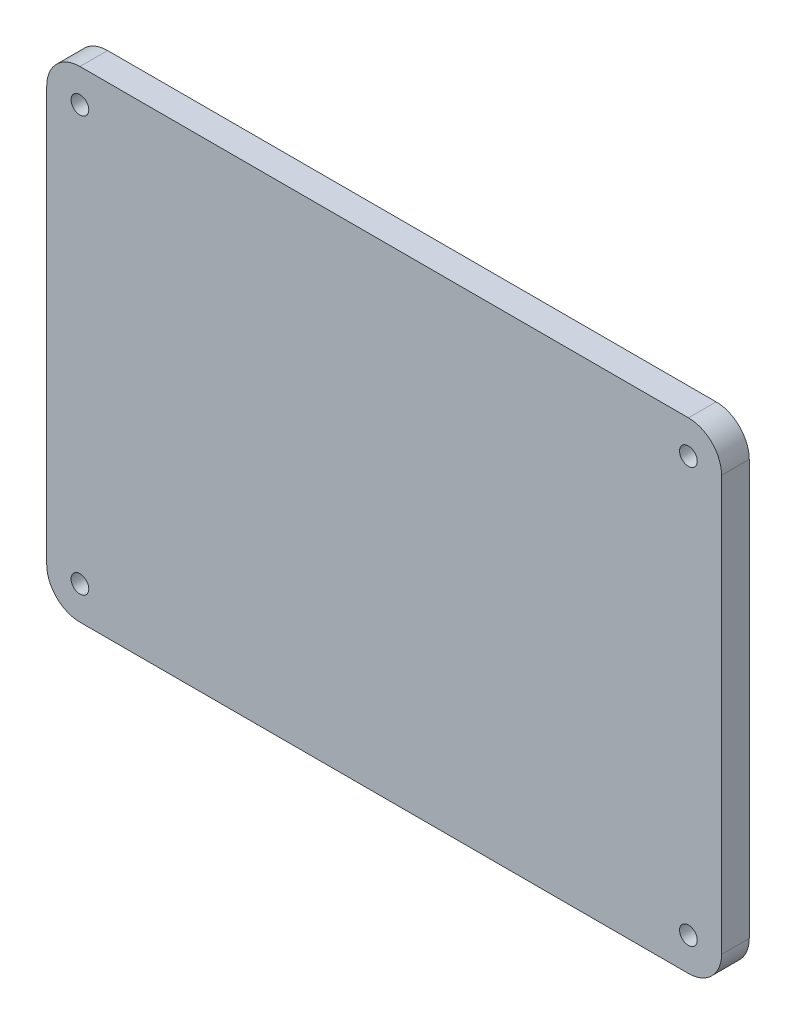
ISO-10303-21;
HEADER;
FILE_DESCRIPTION(('STEP AP214'),'2;1');
FILE_NAME('part.step','',(''),(''),'','','');
FILE_SCHEMA(('AUTOMOTIVE_DESIGN { 1 0 10303 214 1 1 1 1 }'));
ENDSEC;
DATA;
#1=APPLICATION_CONTEXT('core data for automotive mechanical design processes');
#2=APPLICATION_PROTOCOL_DEFINITION('international standard','automotive_design',2000,#1);
#3=PRODUCT_CONTEXT('',#1,'mechanical');
#4=PRODUCT('Part','Part','',(#3));
#5=PRODUCT_RELATED_PRODUCT_CATEGORY('part','',(#4));
#6=PRODUCT_DEFINITION_FORMATION('','',#4);
#7=PRODUCT_DEFINITION_CONTEXT('part definition',#1,'design');
#8=PRODUCT_DEFINITION('design','',#6,#7);
#9=PRODUCT_DEFINITION_SHAPE('','',#8);
#10=(LENGTH_UNIT() NAMED_UNIT(*) SI_UNIT(.MILLI.,.METRE.));
#11=(NAMED_UNIT(*) PLANE_ANGLE_UNIT() SI_UNIT($,.RADIAN.));
#12=(NAMED_UNIT(*) SI_UNIT($,.STERADIAN.) SOLID_ANGLE_UNIT());
#13=UNCERTAINTY_MEASURE_WITH_UNIT(LENGTH_MEASURE(1.E-05),#10,'distance_accuracy_value','');
#14=(GEOMETRIC_REPRESENTATION_CONTEXT(3) GLOBAL_UNCERTAINTY_ASSIGNED_CONTEXT((#13)) GLOBAL_UNIT_ASSIGNED_CONTEXT((#10,
#11,#12)) REPRESENTATION_CONTEXT('',''));
#15=CARTESIAN_POINT('',(0.,0.,0.));
#16=DIRECTION('',(0.,0.,1.));
#17=DIRECTION('',(1.,0.,0.));
#18=AXIS2_PLACEMENT_3D('',#15,#16,#17);
#19=CARTESIAN_POINT('',(130.,-7.99999999999994,5.));
#20=DIRECTION('',(0.,0.,1.));
#21=DIRECTION('',(1.,0.,0.));
#22=AXIS2_PLACEMENT_3D('',#19,#20,#21);
#23=PLANE('',#22);
#24=CARTESIAN_POINT('',(20.0000000000003,-7.99999999999997,5.));
#25=DIRECTION('',(0.,0.,1.));
#26=DIRECTION('',(1.,0.,0.));
#27=AXIS2_PLACEMENT_3D('',#24,#25,#26);
#28=CIRCLE('',#27,1.6);
#29=CARTESIAN_POINT('',(21.6000000000003,-7.99999999999997,5.));
#30=VERTEX_POINT('',#29);
#31=EDGE_CURVE('E191',#30,#30,#28,.T.);
#32=ORIENTED_EDGE('',*,*,#31,.F.);
#33=EDGE_LOOP('',(#32));
#34=FACE_BOUND('',#33,.T.);
#35=CARTESIAN_POINT('',(130.,67.0000000000001,5.));
#36=DIRECTION('',(0.,0.,1.));
#37=DIRECTION('',(1.,0.,0.));
#38=AXIS2_PLACEMENT_3D('',#35,#36,#37);
#39=CIRCLE('',#38,1.59999999999999);
#40=CARTESIAN_POINT('',(131.6,67.0000000000001,5.));
#41=VERTEX_POINT('',#40);
#42=EDGE_CURVE('E137',#41,#41,#39,.T.);
#43=ORIENTED_EDGE('',*,*,#42,.F.);
#44=EDGE_LOOP('',(#43));
#45=FACE_BOUND('',#44,.T.);
#46=CARTESIAN_POINT('',(130.,-7.99999999999994,5.));
#47=DIRECTION('',(0.,0.,1.));
#48=DIRECTION('',(1.,0.,0.));
#49=AXIS2_PLACEMENT_3D('',#46,#47,#48);
#50=CIRCLE('',#49,6.00000000000001);
#51=CARTESIAN_POINT('',(130.,-14.,5.));
#52=VERTEX_POINT('',#51);
#53=CARTESIAN_POINT('',(136.,-7.99999999999994,5.));
#54=VERTEX_POINT('',#53);
#55=EDGE_CURVE('E148',#52,#54,#50,.T.);
#56=ORIENTED_EDGE('',*,*,#55,.T.);
#57=DIRECTION('',(0.,1.,0.));
#58=VECTOR('',#57,1.);
#59=CARTESIAN_POINT('',(136.,-7.99999999999994,5.));
#60=LINE('',#59,#58);
#61=CARTESIAN_POINT('',(136.,67.0000000000001,5.));
#62=VERTEX_POINT('',#61);
#63=EDGE_CURVE('E96',#54,#62,#60,.T.);
#64=ORIENTED_EDGE('',*,*,#63,.T.);
#65=CARTESIAN_POINT('',(130.,67.0000000000001,5.));
#66=DIRECTION('',(0.,0.,1.));
#67=DIRECTION('',(1.,0.,0.));
#68=AXIS2_PLACEMENT_3D('',#65,#66,#67);
#69=CIRCLE('',#68,5.99999999999973);
#70=CARTESIAN_POINT('',(130.,73.0000000000001,5.));
#71=VERTEX_POINT('',#70);
#72=EDGE_CURVE('E163',#62,#71,#69,.T.);
#73=ORIENTED_EDGE('',*,*,#72,.T.);
#74=DIRECTION('',(-1.,0.,0.));
#75=VECTOR('',#74,1.);
#76=CARTESIAN_POINT('',(130.,73.0000000000001,5.));
#77=LINE('',#76,#75);
#78=CARTESIAN_POINT('',(19.9999999999999,72.9999999999995,5.));
#79=VERTEX_POINT('',#78);
#80=EDGE_CURVE('E176',#71,#79,#77,.T.);
#81=ORIENTED_EDGE('',*,*,#80,.T.);
#82=CARTESIAN_POINT('',(20.0000000000003,66.9999999999993,5.));
#83=DIRECTION('',(0.,0.,1.));
#84=DIRECTION('',(1.,0.,0.));
#85=AXIS2_PLACEMENT_3D('',#82,#83,#84);
#86=CIRCLE('',#85,6.00000000000022);
#87=CARTESIAN_POINT('',(13.9999999999999,66.9999999999993,5.));
#88=VERTEX_POINT('',#87);
#89=EDGE_CURVE('E115',#79,#88,#86,.T.);
#90=ORIENTED_EDGE('',*,*,#89,.T.);
#91=DIRECTION('',(0.,-1.,0.));
#92=VECTOR('',#91,1.);
#93=CARTESIAN_POINT('',(14.0000000000003,-8.00000000000071,5.));
#94=LINE('',#93,#92);
#95=CARTESIAN_POINT('',(14.0000000000003,-8.00000000000071,5.));
#96=VERTEX_POINT('',#95);
#97=EDGE_CURVE('E109',#88,#96,#94,.T.);
#98=ORIENTED_EDGE('',*,*,#97,.T.);
#99=CARTESIAN_POINT('',(20.0000000000003,-8.00000000000071,5.));
#100=DIRECTION('',(0.,0.,1.));
#101=DIRECTION('',(1.,0.,0.));
#102=AXIS2_PLACEMENT_3D('',#99,#100,#101);
#103=CIRCLE('',#102,6.00000000000002);
#104=CARTESIAN_POINT('',(20.0000000000003,-14.0000000000007,5.));
#105=VERTEX_POINT('',#104);
#106=EDGE_CURVE('E113',#96,#105,#103,.T.);
#107=ORIENTED_EDGE('',*,*,#106,.T.);
#108=DIRECTION('',(1.,0.,0.));
#109=VECTOR('',#108,1.);
#110=CARTESIAN_POINT('',(130.,-14.,5.));
#111=LINE('',#110,#109);
#112=EDGE_CURVE('E53',#105,#52,#111,.T.);
#113=ORIENTED_EDGE('',*,*,#112,.T.);
#114=EDGE_LOOP('',(#56,#64,#73,#81,#90,#98,#107,#113));
#115=FACE_BOUND('',#114,.T.);
#116=CARTESIAN_POINT('',(20.0000000000003,67.,5.));
#117=DIRECTION('',(0.,0.,1.));
#118=DIRECTION('',(1.,0.,0.));
#119=AXIS2_PLACEMENT_3D('',#116,#117,#118);
#120=CIRCLE('',#119,1.6);
#121=CARTESIAN_POINT('',(21.6000000000003,67.,5.));
#122=VERTEX_POINT('',#121);
#123=EDGE_CURVE('E185',#122,#122,#120,.T.);
#124=ORIENTED_EDGE('',*,*,#123,.F.);
#125=EDGE_LOOP('',(#124));
#126=FACE_BOUND('',#125,.T.);
#127=CARTESIAN_POINT('',(130.,-7.99999999999994,5.));
#128=DIRECTION('',(0.,0.,1.));
#129=DIRECTION('',(1.,0.,0.));
#130=AXIS2_PLACEMENT_3D('',#127,#128,#129);
#131=CIRCLE('',#130,1.59999999999999);
#132=CARTESIAN_POINT('',(131.6,-7.99999999999994,5.));
#133=VERTEX_POINT('',#132);
#134=EDGE_CURVE('E197',#133,#133,#131,.T.);
#135=ORIENTED_EDGE('',*,*,#134,.F.);
#136=EDGE_LOOP('',(#135));
#137=FACE_BOUND('',#136,.T.);
#138=ADVANCED_FACE('F36',(#34,#45,#115,#126,#137),#23,.T.);
#139=CARTESIAN_POINT('',(130.,-7.99999999999994,0.));
#140=DIRECTION('',(0.,0.,1.));
#141=DIRECTION('',(1.,0.,0.));
#142=AXIS2_PLACEMENT_3D('',#139,#140,#141);
#143=PLANE('',#142);
#144=CARTESIAN_POINT('',(130.,-7.99999999999994,0.));
#145=DIRECTION('',(0.,0.,1.));
#146=DIRECTION('',(1.,0.,0.));
#147=AXIS2_PLACEMENT_3D('',#144,#145,#146);
#148=CIRCLE('',#147,6.00000000000001);
#149=CARTESIAN_POINT('',(130.,-14.,0.));
#150=VERTEX_POINT('',#149);
#151=CARTESIAN_POINT('',(136.,-7.99999999999994,0.));
#152=VERTEX_POINT('',#151);
#153=EDGE_CURVE('E133',#150,#152,#148,.T.);
#154=ORIENTED_EDGE('',*,*,#153,.F.);
#155=DIRECTION('',(1.,0.,0.));
#156=VECTOR('',#155,1.);
#157=CARTESIAN_POINT('',(130.,-14.,0.));
#158=LINE('',#157,#156);
#159=CARTESIAN_POINT('',(20.0000000000003,-14.0000000000007,0.));
#160=VERTEX_POINT('',#159);
#161=EDGE_CURVE('E88',#160,#150,#158,.T.);
#162=ORIENTED_EDGE('',*,*,#161,.F.);
#163=CARTESIAN_POINT('',(20.0000000000003,-8.00000000000071,0.));
#164=DIRECTION('',(0.,0.,1.));
#165=DIRECTION('',(1.,0.,0.));
#166=AXIS2_PLACEMENT_3D('',#163,#164,#165);
#167=CIRCLE('',#166,6.00000000000002);
#168=CARTESIAN_POINT('',(14.0000000000003,-8.00000000000071,0.));
#169=VERTEX_POINT('',#168);
#170=EDGE_CURVE('E82',#169,#160,#167,.T.);
#171=ORIENTED_EDGE('',*,*,#170,.F.);
#172=DIRECTION('',(0.,-1.,0.));
#173=VECTOR('',#172,1.);
#174=CARTESIAN_POINT('',(14.0000000000003,-8.00000000000071,0.));
#175=LINE('',#174,#173);
#176=CARTESIAN_POINT('',(13.9999999999999,66.9999999999993,0.));
#177=VERTEX_POINT('',#176);
#178=EDGE_CURVE('E123',#177,#169,#175,.T.);
#179=ORIENTED_EDGE('',*,*,#178,.F.);
#180=CARTESIAN_POINT('',(20.0000000000003,66.9999999999993,0.));
#181=DIRECTION('',(0.,0.,1.));
#182=DIRECTION('',(1.,0.,0.));
#183=AXIS2_PLACEMENT_3D('',#180,#181,#182);
#184=CIRCLE('',#183,6.00000000000022);
#185=CARTESIAN_POINT('',(19.9999999999999,72.9999999999995,0.));
#186=VERTEX_POINT('',#185);
#187=EDGE_CURVE('E143',#186,#177,#184,.T.);
#188=ORIENTED_EDGE('',*,*,#187,.F.);
#189=DIRECTION('',(-1.,0.,0.));
#190=VECTOR('',#189,1.);
#191=CARTESIAN_POINT('',(130.,73.0000000000001,0.));
#192=LINE('',#191,#190);
#193=CARTESIAN_POINT('',(130.,73.0000000000001,0.));
#194=VERTEX_POINT('',#193);
#195=EDGE_CURVE('E141',#194,#186,#192,.T.);
#196=ORIENTED_EDGE('',*,*,#195,.F.);
#197=CARTESIAN_POINT('',(130.,67.0000000000001,0.));
#198=DIRECTION('',(0.,0.,1.));
#199=DIRECTION('',(1.,0.,0.));
#200=AXIS2_PLACEMENT_3D('',#197,#198,#199);
#201=CIRCLE('',#200,5.99999999999973);
#202=CARTESIAN_POINT('',(136.,67.0000000000001,0.));
#203=VERTEX_POINT('',#202);
#204=EDGE_CURVE('E139',#203,#194,#201,.T.);
#205=ORIENTED_EDGE('',*,*,#204,.F.);
#206=DIRECTION('',(0.,1.,0.));
#207=VECTOR('',#206,1.);
#208=CARTESIAN_POINT('',(136.,-7.99999999999994,0.));
#209=LINE('',#208,#207);
#210=EDGE_CURVE('E136',#152,#203,#209,.T.);
#211=ORIENTED_EDGE('',*,*,#210,.F.);
#212=EDGE_LOOP('',(#154,#162,#171,#179,#188,#196,#205,#211));
#213=FACE_BOUND('',#212,.T.);
#214=CARTESIAN_POINT('',(130.,67.0000000000001,0.));
#215=DIRECTION('',(0.,0.,1.));
#216=DIRECTION('',(1.,0.,0.));
#217=AXIS2_PLACEMENT_3D('',#214,#215,#216);
#218=CIRCLE('',#217,1.59999999999999);
#219=CARTESIAN_POINT('',(131.6,67.0000000000001,0.));
#220=VERTEX_POINT('',#219);
#221=EDGE_CURVE('E182',#220,#220,#218,.T.);
#222=ORIENTED_EDGE('',*,*,#221,.T.);
#223=EDGE_LOOP('',(#222));
#224=FACE_BOUND('',#223,.T.);
#225=CARTESIAN_POINT('',(20.0000000000003,67.,0.));
#226=DIRECTION('',(0.,0.,1.));
#227=DIRECTION('',(1.,0.,0.));
#228=AXIS2_PLACEMENT_3D('',#225,#226,#227);
#229=CIRCLE('',#228,1.6);
#230=CARTESIAN_POINT('',(21.6000000000003,67.,0.));
#231=VERTEX_POINT('',#230);
#232=EDGE_CURVE('E188',#231,#231,#229,.T.);
#233=ORIENTED_EDGE('',*,*,#232,.T.);
#234=EDGE_LOOP('',(#233));
#235=FACE_BOUND('',#234,.T.);
#236=CARTESIAN_POINT('',(20.0000000000003,-7.99999999999997,0.));
#237=DIRECTION('',(0.,0.,1.));
#238=DIRECTION('',(1.,0.,0.));
#239=AXIS2_PLACEMENT_3D('',#236,#237,#238);
#240=CIRCLE('',#239,1.6);
#241=CARTESIAN_POINT('',(21.6000000000003,-7.99999999999997,0.));
#242=VERTEX_POINT('',#241);
#243=EDGE_CURVE('E194',#242,#242,#240,.T.);
#244=ORIENTED_EDGE('',*,*,#243,.T.);
#245=EDGE_LOOP('',(#244));
#246=FACE_BOUND('',#245,.T.);
#247=CARTESIAN_POINT('',(130.,-7.99999999999994,0.));
#248=DIRECTION('',(0.,0.,1.));
#249=DIRECTION('',(1.,0.,0.));
#250=AXIS2_PLACEMENT_3D('',#247,#248,#249);
#251=CIRCLE('',#250,1.59999999999999);
#252=CARTESIAN_POINT('',(131.6,-7.99999999999994,0.));
#253=VERTEX_POINT('',#252);
#254=EDGE_CURVE('E200',#253,#253,#251,.T.);
#255=ORIENTED_EDGE('',*,*,#254,.T.);
#256=EDGE_LOOP('',(#255));
#257=FACE_BOUND('',#256,.T.);
#258=ADVANCED_FACE('F167',(#213,#224,#235,#246,#257),#143,.F.);
#259=CARTESIAN_POINT('',(130.,-7.99999999999994,5.));
#260=DIRECTION('',(0.,0.,-1.));
#261=DIRECTION('',(-1.,0.,0.));
#262=AXIS2_PLACEMENT_3D('',#259,#260,#261);
#263=CYLINDRICAL_SURFACE('',#262,6.00000000000001);
#264=ORIENTED_EDGE('',*,*,#153,.T.);
#265=DIRECTION('',(0.,0.,-1.));
#266=VECTOR('',#265,1.);
#267=CARTESIAN_POINT('',(136.,-7.99999999999994,5.));
#268=LINE('',#267,#266);
#269=EDGE_CURVE('E11',#54,#152,#268,.T.);
#270=ORIENTED_EDGE('',*,*,#269,.F.);
#271=ORIENTED_EDGE('',*,*,#55,.F.);
#272=DIRECTION('',(0.,0.,-1.));
#273=VECTOR('',#272,1.);
#274=CARTESIAN_POINT('',(130.,-14.,5.));
#275=LINE('',#274,#273);
#276=EDGE_CURVE('E129',#52,#150,#275,.T.);
#277=ORIENTED_EDGE('',*,*,#276,.T.);
#278=EDGE_LOOP('',(#264,#270,#271,#277));
#279=FACE_BOUND('',#278,.T.);
#280=ADVANCED_FACE('F38',(#279),#263,.T.);
#281=CARTESIAN_POINT('',(136.,-7.99999999999994,5.));
#282=DIRECTION('',(-1.,0.,0.));
#283=DIRECTION('',(0.,-1.,0.));
#284=AXIS2_PLACEMENT_3D('',#281,#282,#283);
#285=PLANE('',#284);
#286=ORIENTED_EDGE('',*,*,#210,.T.);
#287=DIRECTION('',(0.,0.,-1.));
#288=VECTOR('',#287,1.);
#289=CARTESIAN_POINT('',(136.,67.0000000000001,5.));
#290=LINE('',#289,#288);
#291=EDGE_CURVE('E45',#62,#203,#290,.T.);
#292=ORIENTED_EDGE('',*,*,#291,.F.);
#293=ORIENTED_EDGE('',*,*,#63,.F.);
#294=ORIENTED_EDGE('',*,*,#269,.T.);
#295=EDGE_LOOP('',(#286,#292,#293,#294));
#296=FACE_BOUND('',#295,.T.);
#297=ADVANCED_FACE('F234',(#296),#285,.F.);
#298=CARTESIAN_POINT('',(130.,67.0000000000001,5.));
#299=DIRECTION('',(0.,0.,-1.));
#300=DIRECTION('',(-1.,0.,0.));
#301=AXIS2_PLACEMENT_3D('',#298,#299,#300);
#302=CYLINDRICAL_SURFACE('',#301,5.99999999999973);
#303=ORIENTED_EDGE('',*,*,#204,.T.);
#304=DIRECTION('',(0.,0.,-1.));
#305=VECTOR('',#304,1.);
#306=CARTESIAN_POINT('',(130.,73.0000000000001,5.));
#307=LINE('',#306,#305);
#308=EDGE_CURVE('E155',#71,#194,#307,.T.);
#309=ORIENTED_EDGE('',*,*,#308,.F.);
#310=ORIENTED_EDGE('',*,*,#72,.F.);
#311=ORIENTED_EDGE('',*,*,#291,.T.);
#312=EDGE_LOOP('',(#303,#309,#310,#311));
#313=FACE_BOUND('',#312,.T.);
#314=ADVANCED_FACE('F161',(#313),#302,.T.);
#315=CARTESIAN_POINT('',(130.,73.0000000000001,5.));
#316=DIRECTION('',(0.,-1.,0.));
#317=DIRECTION('',(1.,0.,0.));
#318=AXIS2_PLACEMENT_3D('',#315,#316,#317);
#319=PLANE('',#318);
#320=ORIENTED_EDGE('',*,*,#195,.T.);
#321=DIRECTION('',(0.,0.,-1.));
#322=VECTOR('',#321,1.);
#323=CARTESIAN_POINT('',(19.9999999999999,72.9999999999995,5.));
#324=LINE('',#323,#322);
#325=EDGE_CURVE('E152',#79,#186,#324,.T.);
#326=ORIENTED_EDGE('',*,*,#325,.F.);
#327=ORIENTED_EDGE('',*,*,#80,.F.);
#328=ORIENTED_EDGE('',*,*,#308,.T.);
#329=EDGE_LOOP('',(#320,#326,#327,#328));
#330=FACE_BOUND('',#329,.T.);
#331=ADVANCED_FACE('F172',(#330),#319,.F.);
#332=CARTESIAN_POINT('',(20.0000000000003,66.9999999999993,5.));
#333=DIRECTION('',(0.,0.,-1.));
#334=DIRECTION('',(-1.,0.,0.));
#335=AXIS2_PLACEMENT_3D('',#332,#333,#334);
#336=CYLINDRICAL_SURFACE('',#335,6.00000000000022);
#337=ORIENTED_EDGE('',*,*,#187,.T.);
#338=DIRECTION('',(0.,0.,-1.));
#339=VECTOR('',#338,1.);
#340=CARTESIAN_POINT('',(13.9999999999999,66.9999999999993,5.));
#341=LINE('',#340,#339);
#342=EDGE_CURVE('E124',#88,#177,#341,.T.);
#343=ORIENTED_EDGE('',*,*,#342,.F.);
#344=ORIENTED_EDGE('',*,*,#89,.F.);
#345=ORIENTED_EDGE('',*,*,#325,.T.);
#346=EDGE_LOOP('',(#337,#343,#344,#345));
#347=FACE_BOUND('',#346,.T.);
#348=ADVANCED_FACE('F175',(#347),#336,.T.);
#349=CARTESIAN_POINT('',(14.0000000000003,-8.00000000000071,5.));
#350=DIRECTION('',(1.,0.,0.));
#351=DIRECTION('',(0.,1.,0.));
#352=AXIS2_PLACEMENT_3D('',#349,#350,#351);
#353=PLANE('',#352);
#354=ORIENTED_EDGE('',*,*,#178,.T.);
#355=DIRECTION('',(0.,0.,-1.));
#356=VECTOR('',#355,1.);
#357=CARTESIAN_POINT('',(14.0000000000003,-8.00000000000071,5.));
#358=LINE('',#357,#356);
#359=EDGE_CURVE('E120',#96,#169,#358,.T.);
#360=ORIENTED_EDGE('',*,*,#359,.F.);
#361=ORIENTED_EDGE('',*,*,#97,.F.);
#362=ORIENTED_EDGE('',*,*,#342,.T.);
#363=EDGE_LOOP('',(#354,#360,#361,#362));
#364=FACE_BOUND('',#363,.T.);
#365=ADVANCED_FACE('F121',(#364),#353,.F.);
#366=CARTESIAN_POINT('',(20.0000000000003,-8.00000000000071,5.));
#367=DIRECTION('',(0.,0.,-1.));
#368=DIRECTION('',(-1.,0.,0.));
#369=AXIS2_PLACEMENT_3D('',#366,#367,#368);
#370=CYLINDRICAL_SURFACE('',#369,6.00000000000002);
#371=ORIENTED_EDGE('',*,*,#170,.T.);
#372=DIRECTION('',(0.,0.,-1.));
#373=VECTOR('',#372,1.);
#374=CARTESIAN_POINT('',(20.0000000000003,-14.0000000000007,5.));
#375=LINE('',#374,#373);
#376=EDGE_CURVE('E125',#105,#160,#375,.T.);
#377=ORIENTED_EDGE('',*,*,#376,.F.);
#378=ORIENTED_EDGE('',*,*,#106,.F.);
#379=ORIENTED_EDGE('',*,*,#359,.T.);
#380=EDGE_LOOP('',(#371,#377,#378,#379));
#381=FACE_BOUND('',#380,.T.);
#382=ADVANCED_FACE('F127',(#381),#370,.T.);
#383=CARTESIAN_POINT('',(130.,-14.,5.));
#384=DIRECTION('',(0.,1.,0.));
#385=DIRECTION('',(-1.,0.,0.));
#386=AXIS2_PLACEMENT_3D('',#383,#384,#385);
#387=PLANE('',#386);
#388=ORIENTED_EDGE('',*,*,#161,.T.);
#389=ORIENTED_EDGE('',*,*,#276,.F.);
#390=ORIENTED_EDGE('',*,*,#112,.F.);
#391=ORIENTED_EDGE('',*,*,#376,.T.);
#392=EDGE_LOOP('',(#388,#389,#390,#391));
#393=FACE_BOUND('',#392,.T.);
#394=ADVANCED_FACE('F222',(#393),#387,.F.);
#395=CARTESIAN_POINT('',(130.,67.0000000000001,5.));
#396=DIRECTION('',(0.,0.,-1.));
#397=DIRECTION('',(-1.,0.,0.));
#398=AXIS2_PLACEMENT_3D('',#395,#396,#397);
#399=CYLINDRICAL_SURFACE('',#398,1.59999999999999);
#400=ORIENTED_EDGE('',*,*,#42,.T.);
#401=EDGE_LOOP('',(#400));
#402=FACE_BOUND('',#401,.T.);
#403=ORIENTED_EDGE('',*,*,#221,.F.);
#404=EDGE_LOOP('',(#403));
#405=FACE_BOUND('',#404,.T.);
#406=ADVANCED_FACE('F219',(#402,#405),#399,.F.);
#407=CARTESIAN_POINT('',(20.0000000000003,67.,5.));
#408=DIRECTION('',(0.,0.,-1.));
#409=DIRECTION('',(-1.,0.,0.));
#410=AXIS2_PLACEMENT_3D('',#407,#408,#409);
#411=CYLINDRICAL_SURFACE('',#410,1.6);
#412=ORIENTED_EDGE('',*,*,#123,.T.);
#413=EDGE_LOOP('',(#412));
#414=FACE_BOUND('',#413,.T.);
#415=ORIENTED_EDGE('',*,*,#232,.F.);
#416=EDGE_LOOP('',(#415));
#417=FACE_BOUND('',#416,.T.);
#418=ADVANCED_FACE('F298',(#414,#417),#411,.F.);
#419=CARTESIAN_POINT('',(20.0000000000003,-7.99999999999997,5.));
#420=DIRECTION('',(0.,0.,-1.));
#421=DIRECTION('',(-1.,0.,0.));
#422=AXIS2_PLACEMENT_3D('',#419,#420,#421);
#423=CYLINDRICAL_SURFACE('',#422,1.6);
#424=ORIENTED_EDGE('',*,*,#31,.T.);
#425=EDGE_LOOP('',(#424));
#426=FACE_BOUND('',#425,.T.);
#427=ORIENTED_EDGE('',*,*,#243,.F.);
#428=EDGE_LOOP('',(#427));
#429=FACE_BOUND('',#428,.T.);
#430=ADVANCED_FACE('F306',(#426,#429),#423,.F.);
#431=CARTESIAN_POINT('',(130.,-7.99999999999994,5.));
#432=DIRECTION('',(0.,0.,-1.));
#433=DIRECTION('',(-1.,0.,0.));
#434=AXIS2_PLACEMENT_3D('',#431,#432,#433);
#435=CYLINDRICAL_SURFACE('',#434,1.59999999999999);
#436=ORIENTED_EDGE('',*,*,#134,.T.);
#437=EDGE_LOOP('',(#436));
#438=FACE_BOUND('',#437,.T.);
#439=ORIENTED_EDGE('',*,*,#254,.F.);
#440=EDGE_LOOP('',(#439));
#441=FACE_BOUND('',#440,.T.);
#442=ADVANCED_FACE('F206',(#438,#441),#435,.F.);
#443=CLOSED_SHELL('',(#138,#258,#280,#297,#314,#331,#348,#365,#382,#394,#406,#418,#430,#442));
#444=MANIFOLD_SOLID_BREP('B2',#443);
#445=ADVANCED_BREP_SHAPE_REPRESENTATION('',(#18,#444),#14);
#446=SHAPE_DEFINITION_REPRESENTATION(#9,#445);
ENDSEC;
END-ISO-10303-21;
